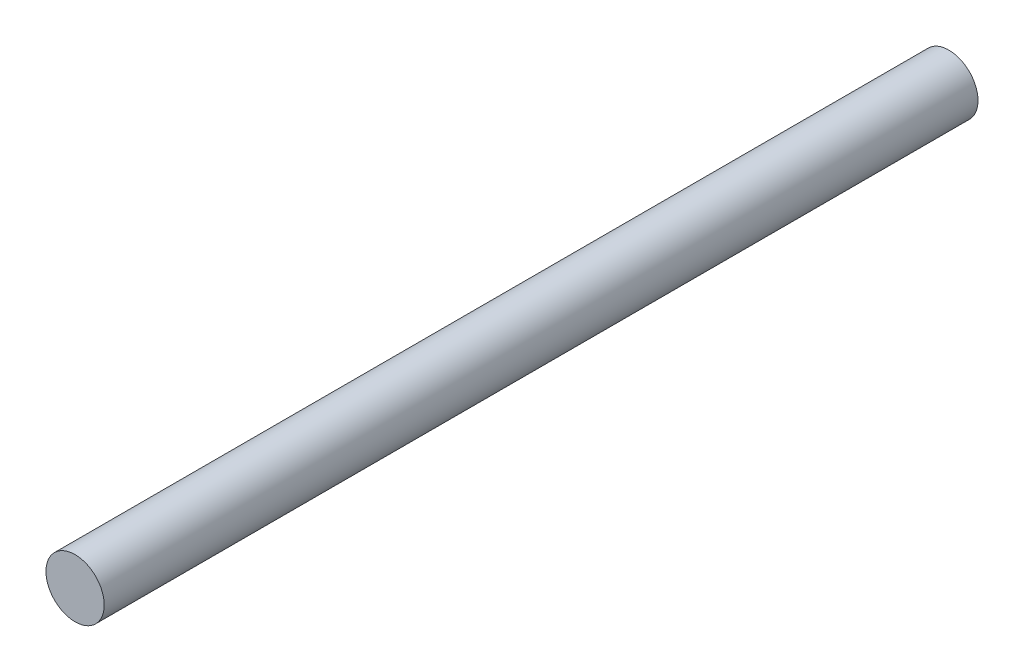
ISO-10303-21;
HEADER;
FILE_DESCRIPTION(('STEP AP214'),'2;1');
FILE_NAME('part.step','',(''),(''),'','','');
FILE_SCHEMA(('AUTOMOTIVE_DESIGN { 1 0 10303 214 1 1 1 1 }'));
ENDSEC;
DATA;
#1=APPLICATION_CONTEXT('core data for automotive mechanical design processes');
#2=APPLICATION_PROTOCOL_DEFINITION('international standard','automotive_design',2000,#1);
#3=PRODUCT_CONTEXT('',#1,'mechanical');
#4=PRODUCT('Part','Part','',(#3));
#5=PRODUCT_RELATED_PRODUCT_CATEGORY('part','',(#4));
#6=PRODUCT_DEFINITION_FORMATION('','',#4);
#7=PRODUCT_DEFINITION_CONTEXT('part definition',#1,'design');
#8=PRODUCT_DEFINITION('design','',#6,#7);
#9=PRODUCT_DEFINITION_SHAPE('','',#8);
#10=(LENGTH_UNIT() NAMED_UNIT(*) SI_UNIT(.MILLI.,.METRE.));
#11=(NAMED_UNIT(*) PLANE_ANGLE_UNIT() SI_UNIT($,.RADIAN.));
#12=(NAMED_UNIT(*) SI_UNIT($,.STERADIAN.) SOLID_ANGLE_UNIT());
#13=UNCERTAINTY_MEASURE_WITH_UNIT(LENGTH_MEASURE(1.E-05),#10,'distance_accuracy_value','');
#14=(GEOMETRIC_REPRESENTATION_CONTEXT(3) GLOBAL_UNCERTAINTY_ASSIGNED_CONTEXT((#13)) GLOBAL_UNIT_ASSIGNED_CONTEXT((#10,
#11,#12)) REPRESENTATION_CONTEXT('',''));
#15=CARTESIAN_POINT('',(0.,0.,0.));
#16=DIRECTION('',(0.,0.,1.));
#17=DIRECTION('',(1.,0.,0.));
#18=AXIS2_PLACEMENT_3D('',#15,#16,#17);
#19=CARTESIAN_POINT('',(0.,0.,15.));
#20=DIRECTION('',(0.,0.,-1.));
#21=DIRECTION('',(-1.,0.,0.));
#22=AXIS2_PLACEMENT_3D('',#19,#20,#21);
#23=CYLINDRICAL_SURFACE('',#22,0.5);
#24=CARTESIAN_POINT('',(0.,0.,15.));
#25=DIRECTION('',(0.,0.,1.));
#26=DIRECTION('',(1.,0.,0.));
#27=AXIS2_PLACEMENT_3D('',#24,#25,#26);
#28=CIRCLE('',#27,0.5);
#29=CARTESIAN_POINT('',(0.5,0.,15.));
#30=VERTEX_POINT('',#29);
#31=EDGE_CURVE('E10',#30,#30,#28,.T.);
#32=ORIENTED_EDGE('',*,*,#31,.F.);
#33=EDGE_LOOP('',(#32));
#34=FACE_BOUND('',#33,.T.);
#35=CARTESIAN_POINT('',(0.,0.,0.));
#36=DIRECTION('',(0.,0.,1.));
#37=DIRECTION('',(1.,0.,0.));
#38=AXIS2_PLACEMENT_3D('',#35,#36,#37);
#39=CIRCLE('',#38,0.5);
#40=CARTESIAN_POINT('',(0.5,0.,0.));
#41=VERTEX_POINT('',#40);
#42=EDGE_CURVE('E34',#41,#41,#39,.T.);
#43=ORIENTED_EDGE('',*,*,#42,.T.);
#44=EDGE_LOOP('',(#43));
#45=FACE_BOUND('',#44,.T.);
#46=ADVANCED_FACE('F31',(#34,#45),#23,.T.);
#47=CARTESIAN_POINT('',(0.,0.,15.));
#48=DIRECTION('',(0.,0.,1.));
#49=DIRECTION('',(1.,0.,0.));
#50=AXIS2_PLACEMENT_3D('',#47,#48,#49);
#51=PLANE('',#50);
#52=ORIENTED_EDGE('',*,*,#31,.T.);
#53=EDGE_LOOP('',(#52));
#54=FACE_BOUND('',#53,.T.);
#55=ADVANCED_FACE('F46',(#54),#51,.T.);
#56=CARTESIAN_POINT('',(0.,0.,0.));
#57=DIRECTION('',(0.,0.,1.));
#58=DIRECTION('',(1.,0.,0.));
#59=AXIS2_PLACEMENT_3D('',#56,#57,#58);
#60=PLANE('',#59);
#61=ORIENTED_EDGE('',*,*,#42,.F.);
#62=EDGE_LOOP('',(#61));
#63=FACE_BOUND('',#62,.T.);
#64=ADVANCED_FACE('F44',(#63),#60,.F.);
#65=CLOSED_SHELL('',(#46,#55,#64));
#66=MANIFOLD_SOLID_BREP('B2',#65);
#67=ADVANCED_BREP_SHAPE_REPRESENTATION('',(#18,#66),#14);
#68=SHAPE_DEFINITION_REPRESENTATION(#9,#67);
ENDSEC;
END-ISO-10303-21;
